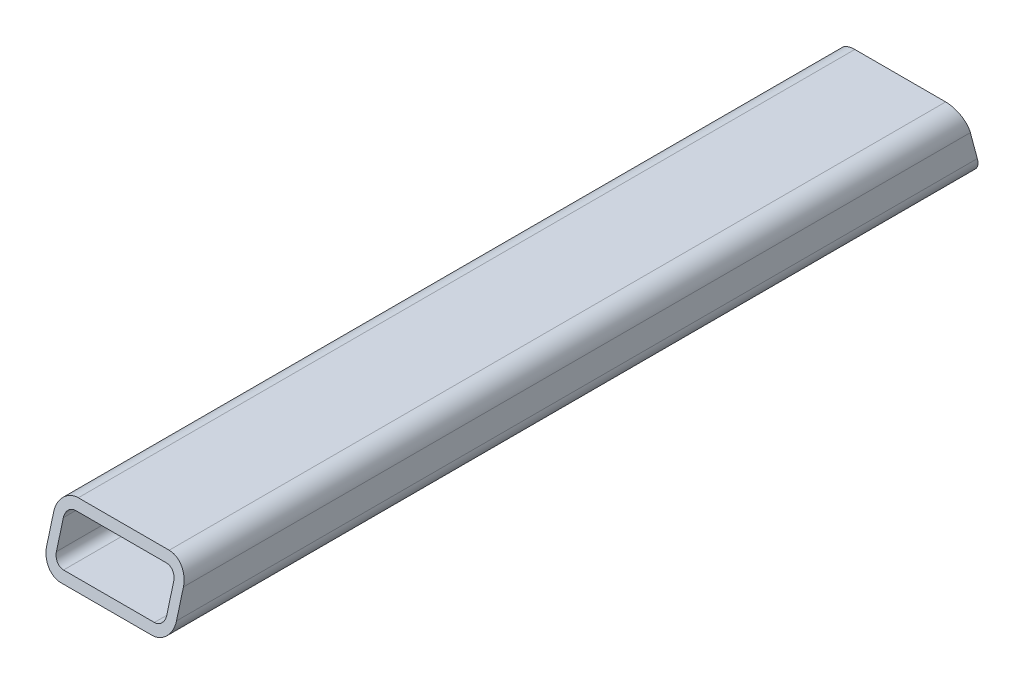
ISO-10303-21;
HEADER;
FILE_DESCRIPTION(('STEP AP214'),'2;1');
FILE_NAME('part.step','',(''),(''),'','','');
FILE_SCHEMA(('AUTOMOTIVE_DESIGN { 1 0 10303 214 1 1 1 1 }'));
ENDSEC;
DATA;
#1=APPLICATION_CONTEXT('core data for automotive mechanical design processes');
#2=APPLICATION_PROTOCOL_DEFINITION('international standard','automotive_design',2000,#1);
#3=PRODUCT_CONTEXT('',#1,'mechanical');
#4=PRODUCT('Part','Part','',(#3));
#5=PRODUCT_RELATED_PRODUCT_CATEGORY('part','',(#4));
#6=PRODUCT_DEFINITION_FORMATION('','',#4);
#7=PRODUCT_DEFINITION_CONTEXT('part definition',#1,'design');
#8=PRODUCT_DEFINITION('design','',#6,#7);
#9=PRODUCT_DEFINITION_SHAPE('','',#8);
#10=(LENGTH_UNIT() NAMED_UNIT(*) SI_UNIT(.MILLI.,.METRE.));
#11=(NAMED_UNIT(*) PLANE_ANGLE_UNIT() SI_UNIT($,.RADIAN.));
#12=(NAMED_UNIT(*) SI_UNIT($,.STERADIAN.) SOLID_ANGLE_UNIT());
#13=UNCERTAINTY_MEASURE_WITH_UNIT(LENGTH_MEASURE(1.E-05),#10,'distance_accuracy_value','');
#14=(GEOMETRIC_REPRESENTATION_CONTEXT(3) GLOBAL_UNCERTAINTY_ASSIGNED_CONTEXT((#13)) GLOBAL_UNIT_ASSIGNED_CONTEXT((#10,
#11,#12)) REPRESENTATION_CONTEXT('',''));
#15=CARTESIAN_POINT('',(0.,0.,0.));
#16=DIRECTION('',(0.,0.,1.));
#17=DIRECTION('',(1.,0.,0.));
#18=AXIS2_PLACEMENT_3D('',#15,#16,#17);
#19=CARTESIAN_POINT('',(14.,-4.,-125.));
#20=DIRECTION('',(0.,0.,1.));
#21=DIRECTION('',(1.,0.,0.));
#22=AXIS2_PLACEMENT_3D('',#19,#20,#21);
#23=CYLINDRICAL_SURFACE('',#22,6.);
#24=DIRECTION('',(0.,0.,1.));
#25=VECTOR('',#24,1.);
#26=CARTESIAN_POINT('',(14.,-10.,-125.));
#27=LINE('',#26,#25);
#28=CARTESIAN_POINT('',(14.,-10.,-125.));
#29=VERTEX_POINT('',#28);
#30=CARTESIAN_POINT('',(14.,-10.,125.));
#31=VERTEX_POINT('',#30);
#32=EDGE_CURVE('E126',#29,#31,#27,.T.);
#33=ORIENTED_EDGE('',*,*,#32,.F.);
#34=CARTESIAN_POINT('',(14.,-4.,-123.392304845413));
#35=DIRECTION('',(0.,0.258819045102518,-0.965925826289069));
#36=DIRECTION('',(0.,0.965925826289069,0.258819045102518));
#37=AXIS2_PLACEMENT_3D('',#34,#35,#36);
#38=ELLIPSE('',#37,6.21165708246049,6.);
#39=CARTESIAN_POINT('',(20.,-3.99999999999996,-123.392304845413));
#40=VERTEX_POINT('',#39);
#41=EDGE_CURVE('E170',#29,#40,#38,.F.);
#42=ORIENTED_EDGE('',*,*,#41,.T.);
#43=DIRECTION('',(0.,0.,1.));
#44=VECTOR('',#43,1.);
#45=CARTESIAN_POINT('',(20.,-3.99999999999996,-125.));
#46=LINE('',#45,#44);
#47=CARTESIAN_POINT('',(20.,-3.99999999999996,123.392304845413));
#48=VERTEX_POINT('',#47);
#49=EDGE_CURVE('E164',#40,#48,#46,.T.);
#50=ORIENTED_EDGE('',*,*,#49,.T.);
#51=CARTESIAN_POINT('',(14.,-4.,123.392304845413));
#52=DIRECTION('',(0.,-0.258819045102518,-0.965925826289069));
#53=DIRECTION('',(0.,-0.965925826289069,0.258819045102518));
#54=AXIS2_PLACEMENT_3D('',#51,#52,#53);
#55=ELLIPSE('',#54,6.21165708246049,6.);
#56=EDGE_CURVE('E173',#48,#31,#55,.T.);
#57=ORIENTED_EDGE('',*,*,#56,.T.);
#58=EDGE_LOOP('',(#33,#42,#50,#57));
#59=FACE_BOUND('',#58,.T.);
#60=ADVANCED_FACE('F43',(#59),#23,.T.);
#61=CARTESIAN_POINT('',(-14.,-10.,-125.));
#62=DIRECTION('',(0.,-1.,0.));
#63=DIRECTION('',(0.,0.,-1.));
#64=AXIS2_PLACEMENT_3D('',#61,#62,#63);
#65=PLANE('',#64);
#66=ORIENTED_EDGE('',*,*,#32,.T.);
#67=DIRECTION('',(1.,0.,0.));
#68=VECTOR('',#67,1.);
#69=CARTESIAN_POINT('',(-14.,-10.,125.));
#70=LINE('',#69,#68);
#71=CARTESIAN_POINT('',(-14.,-10.,125.));
#72=VERTEX_POINT('',#71);
#73=EDGE_CURVE('E179',#72,#31,#70,.T.);
#74=ORIENTED_EDGE('',*,*,#73,.F.);
#75=DIRECTION('',(0.,0.,1.));
#76=VECTOR('',#75,1.);
#77=CARTESIAN_POINT('',(-14.,-10.,-125.));
#78=LINE('',#77,#76);
#79=CARTESIAN_POINT('',(-14.,-10.,-125.));
#80=VERTEX_POINT('',#79);
#81=EDGE_CURVE('E264',#80,#72,#78,.T.);
#82=ORIENTED_EDGE('',*,*,#81,.F.);
#83=DIRECTION('',(1.,0.,0.));
#84=VECTOR('',#83,1.);
#85=CARTESIAN_POINT('',(-14.,-10.,-125.));
#86=LINE('',#85,#84);
#87=EDGE_CURVE('E172',#80,#29,#86,.T.);
#88=ORIENTED_EDGE('',*,*,#87,.T.);
#89=EDGE_LOOP('',(#66,#74,#82,#88));
#90=FACE_BOUND('',#89,.T.);
#91=ADVANCED_FACE('F313',(#90),#65,.T.);
#92=CARTESIAN_POINT('',(-14.,-4.,-125.));
#93=DIRECTION('',(0.,0.,1.));
#94=DIRECTION('',(1.,0.,0.));
#95=AXIS2_PLACEMENT_3D('',#92,#93,#94);
#96=CYLINDRICAL_SURFACE('',#95,6.);
#97=DIRECTION('',(0.,0.,1.));
#98=VECTOR('',#97,1.);
#99=CARTESIAN_POINT('',(-20.,-3.99999999999996,-125.));
#100=LINE('',#99,#98);
#101=CARTESIAN_POINT('',(-20.,-3.99999999999996,-123.392304845413));
#102=VERTEX_POINT('',#101);
#103=CARTESIAN_POINT('',(-20.,-3.99999999999996,123.392304845413));
#104=VERTEX_POINT('',#103);
#105=EDGE_CURVE('E270',#102,#104,#100,.T.);
#106=ORIENTED_EDGE('',*,*,#105,.F.);
#107=CARTESIAN_POINT('',(-14.,-4.,-123.392304845413));
#108=DIRECTION('',(0.,0.258819045102518,-0.965925826289069));
#109=DIRECTION('',(0.,0.965925826289069,0.258819045102518));
#110=AXIS2_PLACEMENT_3D('',#107,#108,#109);
#111=ELLIPSE('',#110,6.2116570824605,6.);
#112=EDGE_CURVE('E177',#102,#80,#111,.F.);
#113=ORIENTED_EDGE('',*,*,#112,.T.);
#114=ORIENTED_EDGE('',*,*,#81,.T.);
#115=CARTESIAN_POINT('',(-14.,-4.,123.392304845413));
#116=DIRECTION('',(0.,-0.258819045102518,-0.965925826289069));
#117=DIRECTION('',(0.,-0.965925826289069,0.258819045102518));
#118=AXIS2_PLACEMENT_3D('',#115,#116,#117);
#119=ELLIPSE('',#118,6.2116570824605,6.);
#120=EDGE_CURVE('E181',#72,#104,#119,.T.);
#121=ORIENTED_EDGE('',*,*,#120,.T.);
#122=EDGE_LOOP('',(#106,#113,#114,#121));
#123=FACE_BOUND('',#122,.T.);
#124=ADVANCED_FACE('F294',(#123),#96,.T.);
#125=CARTESIAN_POINT('',(-20.,3.99999999999996,-125.));
#126=DIRECTION('',(-1.,0.,0.));
#127=DIRECTION('',(0.,0.,1.));
#128=AXIS2_PLACEMENT_3D('',#125,#126,#127);
#129=PLANE('',#128);
#130=DIRECTION('',(0.,0.,1.));
#131=VECTOR('',#130,1.);
#132=CARTESIAN_POINT('',(-20.,3.99999999999996,-125.));
#133=LINE('',#132,#131);
#134=CARTESIAN_POINT('',(-20.,3.99999999999996,-121.248711305964));
#135=VERTEX_POINT('',#134);
#136=CARTESIAN_POINT('',(-20.,3.99999999999996,121.248711305964));
#137=VERTEX_POINT('',#136);
#138=EDGE_CURVE('E269',#135,#137,#133,.T.);
#139=ORIENTED_EDGE('',*,*,#138,.F.);
#140=DIRECTION('',(0.,-0.965925826289069,-0.258819045102518));
#141=VECTOR('',#140,1.);
#142=CARTESIAN_POINT('',(-20.,3.06217782649103,-121.5));
#143=LINE('',#142,#141);
#144=EDGE_CURVE('E286',#135,#102,#143,.T.);
#145=ORIENTED_EDGE('',*,*,#144,.T.);
#146=ORIENTED_EDGE('',*,*,#105,.T.);
#147=DIRECTION('',(0.,-0.965925826289069,0.258819045102518));
#148=VECTOR('',#147,1.);
#149=CARTESIAN_POINT('',(-20.,65.5621778264905,104.753175473055));
#150=LINE('',#149,#148);
#151=EDGE_CURVE('E290',#104,#137,#150,.F.);
#152=ORIENTED_EDGE('',*,*,#151,.T.);
#153=EDGE_LOOP('',(#139,#145,#146,#152));
#154=FACE_BOUND('',#153,.T.);
#155=ADVANCED_FACE('F297',(#154),#129,.T.);
#156=CARTESIAN_POINT('',(-14.,4.,-125.));
#157=DIRECTION('',(0.,0.,1.));
#158=DIRECTION('',(1.,0.,0.));
#159=AXIS2_PLACEMENT_3D('',#156,#157,#158);
#160=CYLINDRICAL_SURFACE('',#159,6.);
#161=DIRECTION('',(0.,0.,1.));
#162=VECTOR('',#161,1.);
#163=CARTESIAN_POINT('',(-14.,10.,-125.));
#164=LINE('',#163,#162);
#165=CARTESIAN_POINT('',(-14.,10.,-119.641016151378));
#166=VERTEX_POINT('',#165);
#167=CARTESIAN_POINT('',(-14.,10.,119.641016151378));
#168=VERTEX_POINT('',#167);
#169=EDGE_CURVE('E273',#166,#168,#164,.T.);
#170=ORIENTED_EDGE('',*,*,#169,.F.);
#171=CARTESIAN_POINT('',(-14.,4.,-121.248711305964));
#172=DIRECTION('',(0.,0.258819045102518,-0.965925826289069));
#173=DIRECTION('',(0.,0.965925826289069,0.258819045102518));
#174=AXIS2_PLACEMENT_3D('',#171,#172,#173);
#175=ELLIPSE('',#174,6.21165708246049,6.);
#176=EDGE_CURVE('E283',#166,#135,#175,.F.);
#177=ORIENTED_EDGE('',*,*,#176,.T.);
#178=ORIENTED_EDGE('',*,*,#138,.T.);
#179=CARTESIAN_POINT('',(-14.,4.,121.248711305964));
#180=DIRECTION('',(0.,-0.258819045102518,-0.965925826289069));
#181=DIRECTION('',(0.,-0.965925826289069,0.258819045102518));
#182=AXIS2_PLACEMENT_3D('',#179,#180,#181);
#183=ELLIPSE('',#182,6.21165708246049,6.);
#184=EDGE_CURVE('E284',#137,#168,#183,.T.);
#185=ORIENTED_EDGE('',*,*,#184,.T.);
#186=EDGE_LOOP('',(#170,#177,#178,#185));
#187=FACE_BOUND('',#186,.T.);
#188=ADVANCED_FACE('F304',(#187),#160,.T.);
#189=CARTESIAN_POINT('',(-14.,10.,-125.));
#190=DIRECTION('',(0.,1.,0.));
#191=DIRECTION('',(0.,0.,1.));
#192=AXIS2_PLACEMENT_3D('',#189,#190,#191);
#193=PLANE('',#192);
#194=DIRECTION('',(0.,0.,1.));
#195=VECTOR('',#194,1.);
#196=CARTESIAN_POINT('',(14.,10.,-125.));
#197=LINE('',#196,#195);
#198=CARTESIAN_POINT('',(14.,10.,-119.641016151378));
#199=VERTEX_POINT('',#198);
#200=CARTESIAN_POINT('',(14.,10.,119.641016151378));
#201=VERTEX_POINT('',#200);
#202=EDGE_CURVE('E276',#199,#201,#197,.T.);
#203=ORIENTED_EDGE('',*,*,#202,.F.);
#204=DIRECTION('',(-1.,0.,0.));
#205=VECTOR('',#204,1.);
#206=CARTESIAN_POINT('',(-14.,10.,-119.641016151378));
#207=LINE('',#206,#205);
#208=EDGE_CURVE('E279',#199,#166,#207,.T.);
#209=ORIENTED_EDGE('',*,*,#208,.T.);
#210=ORIENTED_EDGE('',*,*,#169,.T.);
#211=DIRECTION('',(1.,0.,0.));
#212=VECTOR('',#211,1.);
#213=CARTESIAN_POINT('',(-14.,10.,119.641016151378));
#214=LINE('',#213,#212);
#215=EDGE_CURVE('E261',#168,#201,#214,.T.);
#216=ORIENTED_EDGE('',*,*,#215,.T.);
#217=EDGE_LOOP('',(#203,#209,#210,#216));
#218=FACE_BOUND('',#217,.T.);
#219=ADVANCED_FACE('F310',(#218),#193,.T.);
#220=CARTESIAN_POINT('',(14.,4.,-125.));
#221=DIRECTION('',(0.,0.,1.));
#222=DIRECTION('',(1.,0.,0.));
#223=AXIS2_PLACEMENT_3D('',#220,#221,#222);
#224=CYLINDRICAL_SURFACE('',#223,6.);
#225=DIRECTION('',(0.,0.,1.));
#226=VECTOR('',#225,1.);
#227=CARTESIAN_POINT('',(20.,3.99999999999996,-125.));
#228=LINE('',#227,#226);
#229=CARTESIAN_POINT('',(20.,3.99999999999996,-121.248711305964));
#230=VERTEX_POINT('',#229);
#231=CARTESIAN_POINT('',(20.,3.99999999999996,121.248711305964));
#232=VERTEX_POINT('',#231);
#233=EDGE_CURVE('E163',#230,#232,#228,.T.);
#234=ORIENTED_EDGE('',*,*,#233,.F.);
#235=CARTESIAN_POINT('',(14.,4.,-121.248711305964));
#236=DIRECTION('',(0.,0.258819045102518,-0.965925826289069));
#237=DIRECTION('',(0.,0.965925826289069,0.258819045102518));
#238=AXIS2_PLACEMENT_3D('',#235,#236,#237);
#239=ELLIPSE('',#238,6.2116570824605,6.);
#240=EDGE_CURVE('E11',#230,#199,#239,.F.);
#241=ORIENTED_EDGE('',*,*,#240,.T.);
#242=ORIENTED_EDGE('',*,*,#202,.T.);
#243=CARTESIAN_POINT('',(14.,4.,121.248711305964));
#244=DIRECTION('',(0.,-0.258819045102518,-0.965925826289069));
#245=DIRECTION('',(0.,-0.965925826289069,0.258819045102518));
#246=AXIS2_PLACEMENT_3D('',#243,#244,#245);
#247=ELLIPSE('',#246,6.2116570824605,6.);
#248=EDGE_CURVE('E53',#201,#232,#247,.T.);
#249=ORIENTED_EDGE('',*,*,#248,.T.);
#250=EDGE_LOOP('',(#234,#241,#242,#249));
#251=FACE_BOUND('',#250,.T.);
#252=ADVANCED_FACE('F319',(#251),#224,.T.);
#253=CARTESIAN_POINT('',(20.,3.99999999999996,-125.));
#254=DIRECTION('',(1.,0.,0.));
#255=DIRECTION('',(0.,0.,-1.));
#256=AXIS2_PLACEMENT_3D('',#253,#254,#255);
#257=PLANE('',#256);
#258=ORIENTED_EDGE('',*,*,#49,.F.);
#259=DIRECTION('',(0.,0.965925826289069,0.258819045102518));
#260=VECTOR('',#259,1.);
#261=CARTESIAN_POINT('',(20.,3.06217782649103,-121.5));
#262=LINE('',#261,#260);
#263=EDGE_CURVE('E167',#40,#230,#262,.T.);
#264=ORIENTED_EDGE('',*,*,#263,.T.);
#265=ORIENTED_EDGE('',*,*,#233,.T.);
#266=DIRECTION('',(0.,0.965925826289069,-0.258819045102518));
#267=VECTOR('',#266,1.);
#268=CARTESIAN_POINT('',(20.,65.5621778264905,104.753175473055));
#269=LINE('',#268,#267);
#270=EDGE_CURVE('E158',#232,#48,#269,.F.);
#271=ORIENTED_EDGE('',*,*,#270,.T.);
#272=EDGE_LOOP('',(#258,#264,#265,#271));
#273=FACE_BOUND('',#272,.T.);
#274=ADVANCED_FACE('F165',(#273),#257,.T.);
#275=CARTESIAN_POINT('',(14.,-4.,-125.));
#276=DIRECTION('',(0.,0.,1.));
#277=DIRECTION('',(1.,0.,0.));
#278=AXIS2_PLACEMENT_3D('',#275,#276,#277);
#279=CYLINDRICAL_SURFACE('',#278,3.);
#280=DIRECTION('',(0.,0.,1.));
#281=VECTOR('',#280,1.);
#282=CARTESIAN_POINT('',(17.,-3.99999999999998,-125.));
#283=LINE('',#282,#281);
#284=CARTESIAN_POINT('',(17.,-3.99999999999998,-123.392304845413));
#285=VERTEX_POINT('',#284);
#286=CARTESIAN_POINT('',(17.,-3.99999999999998,123.392304845413));
#287=VERTEX_POINT('',#286);
#288=EDGE_CURVE('E195',#285,#287,#283,.T.);
#289=ORIENTED_EDGE('',*,*,#288,.F.);
#290=CARTESIAN_POINT('',(14.,-4.,-123.392304845413));
#291=DIRECTION('',(0.,0.258819045102518,-0.965925826289069));
#292=DIRECTION('',(0.,0.965925826289069,0.258819045102518));
#293=AXIS2_PLACEMENT_3D('',#290,#291,#292);
#294=ELLIPSE('',#293,3.10582854123025,3.);
#295=CARTESIAN_POINT('',(14.,-7.,-124.196152422707));
#296=VERTEX_POINT('',#295);
#297=EDGE_CURVE('E212',#296,#285,#294,.F.);
#298=ORIENTED_EDGE('',*,*,#297,.F.);
#299=DIRECTION('',(0.,0.,-1.));
#300=VECTOR('',#299,1.);
#301=CARTESIAN_POINT('',(14.,-7.,-125.));
#302=LINE('',#301,#300);
#303=CARTESIAN_POINT('',(14.,-7.,124.196152422707));
#304=VERTEX_POINT('',#303);
#305=EDGE_CURVE('E239',#296,#304,#302,.F.);
#306=ORIENTED_EDGE('',*,*,#305,.T.);
#307=CARTESIAN_POINT('',(14.,-4.,123.392304845413));
#308=DIRECTION('',(0.,-0.258819045102518,-0.965925826289069));
#309=DIRECTION('',(0.,-0.965925826289069,0.258819045102518));
#310=AXIS2_PLACEMENT_3D('',#307,#308,#309);
#311=ELLIPSE('',#310,3.10582854123025,3.);
#312=EDGE_CURVE('E211',#304,#287,#311,.F.);
#313=ORIENTED_EDGE('',*,*,#312,.T.);
#314=EDGE_LOOP('',(#289,#298,#306,#313));
#315=FACE_BOUND('',#314,.T.);
#316=ADVANCED_FACE('F245',(#315),#279,.F.);
#317=CARTESIAN_POINT('',(-14.,-7.,-125.));
#318=DIRECTION('',(0.,-1.,0.));
#319=DIRECTION('',(0.,0.,-1.));
#320=AXIS2_PLACEMENT_3D('',#317,#318,#319);
#321=PLANE('',#320);
#322=ORIENTED_EDGE('',*,*,#305,.F.);
#323=DIRECTION('',(1.,0.,0.));
#324=VECTOR('',#323,1.);
#325=CARTESIAN_POINT('',(-14.,-7.,-124.196152422707));
#326=LINE('',#325,#324);
#327=CARTESIAN_POINT('',(-14.,-7.,-124.196152422707));
#328=VERTEX_POINT('',#327);
#329=EDGE_CURVE('E189',#328,#296,#326,.T.);
#330=ORIENTED_EDGE('',*,*,#329,.F.);
#331=DIRECTION('',(0.,0.,1.));
#332=VECTOR('',#331,1.);
#333=CARTESIAN_POINT('',(-14.,-7.,-125.));
#334=LINE('',#333,#332);
#335=CARTESIAN_POINT('',(-14.,-7.,124.196152422707));
#336=VERTEX_POINT('',#335);
#337=EDGE_CURVE('E238',#328,#336,#334,.T.);
#338=ORIENTED_EDGE('',*,*,#337,.T.);
#339=DIRECTION('',(-1.,0.,0.));
#340=VECTOR('',#339,1.);
#341=CARTESIAN_POINT('',(14.,-7.,124.196152422707));
#342=LINE('',#341,#340);
#343=EDGE_CURVE('E48',#336,#304,#342,.F.);
#344=ORIENTED_EDGE('',*,*,#343,.T.);
#345=EDGE_LOOP('',(#322,#330,#338,#344));
#346=FACE_BOUND('',#345,.T.);
#347=ADVANCED_FACE('F233',(#346),#321,.F.);
#348=CARTESIAN_POINT('',(-14.,-4.,-125.));
#349=DIRECTION('',(0.,0.,1.));
#350=DIRECTION('',(1.,0.,0.));
#351=AXIS2_PLACEMENT_3D('',#348,#349,#350);
#352=CYLINDRICAL_SURFACE('',#351,3.);
#353=ORIENTED_EDGE('',*,*,#337,.F.);
#354=CARTESIAN_POINT('',(-14.,-4.,-123.392304845413));
#355=DIRECTION('',(0.,0.258819045102518,-0.965925826289069));
#356=DIRECTION('',(0.,0.965925826289069,0.258819045102518));
#357=AXIS2_PLACEMENT_3D('',#354,#355,#356);
#358=ELLIPSE('',#357,3.10582854123025,3.);
#359=CARTESIAN_POINT('',(-17.,-3.99999999999996,-123.392304845413));
#360=VERTEX_POINT('',#359);
#361=EDGE_CURVE('E193',#360,#328,#358,.F.);
#362=ORIENTED_EDGE('',*,*,#361,.F.);
#363=DIRECTION('',(0.,0.,1.));
#364=VECTOR('',#363,1.);
#365=CARTESIAN_POINT('',(-17.,-3.99999999999996,-125.));
#366=LINE('',#365,#364);
#367=CARTESIAN_POINT('',(-17.,-3.99999999999996,123.392304845413));
#368=VERTEX_POINT('',#367);
#369=EDGE_CURVE('E247',#360,#368,#366,.T.);
#370=ORIENTED_EDGE('',*,*,#369,.T.);
#371=CARTESIAN_POINT('',(-14.,-4.,123.392304845413));
#372=DIRECTION('',(0.,-0.258819045102518,-0.965925826289069));
#373=DIRECTION('',(0.,-0.965925826289069,0.258819045102518));
#374=AXIS2_PLACEMENT_3D('',#371,#372,#373);
#375=ELLIPSE('',#374,3.10582854123025,3.);
#376=EDGE_CURVE('E120',#368,#336,#375,.F.);
#377=ORIENTED_EDGE('',*,*,#376,.T.);
#378=EDGE_LOOP('',(#353,#362,#370,#377));
#379=FACE_BOUND('',#378,.T.);
#380=ADVANCED_FACE('F391',(#379),#352,.F.);
#381=CARTESIAN_POINT('',(-17.,3.99999999999996,-125.));
#382=DIRECTION('',(-1.,0.,0.));
#383=DIRECTION('',(0.,0.,1.));
#384=AXIS2_PLACEMENT_3D('',#381,#382,#383);
#385=PLANE('',#384);
#386=ORIENTED_EDGE('',*,*,#369,.F.);
#387=DIRECTION('',(0.,-0.965925826289069,-0.258819045102518));
#388=VECTOR('',#387,1.);
#389=CARTESIAN_POINT('',(-17.,3.06217782649103,-121.5));
#390=LINE('',#389,#388);
#391=CARTESIAN_POINT('',(-17.,3.99999999999998,-121.248711305964));
#392=VERTEX_POINT('',#391);
#393=EDGE_CURVE('E196',#392,#360,#390,.T.);
#394=ORIENTED_EDGE('',*,*,#393,.F.);
#395=DIRECTION('',(0.,0.,1.));
#396=VECTOR('',#395,1.);
#397=CARTESIAN_POINT('',(-17.,3.99999999999998,-125.));
#398=LINE('',#397,#396);
#399=CARTESIAN_POINT('',(-17.,3.99999999999998,121.248711305964));
#400=VERTEX_POINT('',#399);
#401=EDGE_CURVE('E251',#392,#400,#398,.T.);
#402=ORIENTED_EDGE('',*,*,#401,.T.);
#403=DIRECTION('',(0.,0.965925826289069,-0.258819045102518));
#404=VECTOR('',#403,1.);
#405=CARTESIAN_POINT('',(-17.,-10.0000000000002,125.));
#406=LINE('',#405,#404);
#407=EDGE_CURVE('E229',#400,#368,#406,.F.);
#408=ORIENTED_EDGE('',*,*,#407,.T.);
#409=EDGE_LOOP('',(#386,#394,#402,#408));
#410=FACE_BOUND('',#409,.T.);
#411=ADVANCED_FACE('F404',(#410),#385,.F.);
#412=CARTESIAN_POINT('',(-14.,4.,-125.));
#413=DIRECTION('',(0.,0.,1.));
#414=DIRECTION('',(1.,0.,0.));
#415=AXIS2_PLACEMENT_3D('',#412,#413,#414);
#416=CYLINDRICAL_SURFACE('',#415,3.);
#417=ORIENTED_EDGE('',*,*,#401,.F.);
#418=CARTESIAN_POINT('',(-14.,4.,-121.248711305964));
#419=DIRECTION('',(0.,0.258819045102518,-0.965925826289069));
#420=DIRECTION('',(0.,0.965925826289069,0.258819045102518));
#421=AXIS2_PLACEMENT_3D('',#418,#419,#420);
#422=ELLIPSE('',#421,3.10582854123025,3.);
#423=CARTESIAN_POINT('',(-14.,7.,-120.444863728671));
#424=VERTEX_POINT('',#423);
#425=EDGE_CURVE('E197',#424,#392,#422,.F.);
#426=ORIENTED_EDGE('',*,*,#425,.F.);
#427=DIRECTION('',(0.,0.,1.));
#428=VECTOR('',#427,1.);
#429=CARTESIAN_POINT('',(-14.,7.,-125.));
#430=LINE('',#429,#428);
#431=CARTESIAN_POINT('',(-14.,7.,120.444863728671));
#432=VERTEX_POINT('',#431);
#433=EDGE_CURVE('E252',#424,#432,#430,.T.);
#434=ORIENTED_EDGE('',*,*,#433,.T.);
#435=CARTESIAN_POINT('',(-14.,4.,121.248711305964));
#436=DIRECTION('',(0.,-0.258819045102518,-0.965925826289069));
#437=DIRECTION('',(0.,-0.965925826289069,0.258819045102518));
#438=AXIS2_PLACEMENT_3D('',#435,#436,#437);
#439=ELLIPSE('',#438,3.10582854123025,3.);
#440=EDGE_CURVE('E228',#432,#400,#439,.F.);
#441=ORIENTED_EDGE('',*,*,#440,.T.);
#442=EDGE_LOOP('',(#417,#426,#434,#441));
#443=FACE_BOUND('',#442,.T.);
#444=ADVANCED_FACE('F411',(#443),#416,.F.);
#445=CARTESIAN_POINT('',(-14.,7.,-125.));
#446=DIRECTION('',(0.,1.,0.));
#447=DIRECTION('',(0.,0.,1.));
#448=AXIS2_PLACEMENT_3D('',#445,#446,#447);
#449=PLANE('',#448);
#450=ORIENTED_EDGE('',*,*,#433,.F.);
#451=DIRECTION('',(-1.,0.,0.));
#452=VECTOR('',#451,1.);
#453=CARTESIAN_POINT('',(-14.,7.,-120.444863728671));
#454=LINE('',#453,#452);
#455=CARTESIAN_POINT('',(14.,7.,-120.444863728671));
#456=VERTEX_POINT('',#455);
#457=EDGE_CURVE('E205',#456,#424,#454,.T.);
#458=ORIENTED_EDGE('',*,*,#457,.F.);
#459=DIRECTION('',(0.,0.,1.));
#460=VECTOR('',#459,1.);
#461=CARTESIAN_POINT('',(14.,7.,-125.));
#462=LINE('',#461,#460);
#463=CARTESIAN_POINT('',(14.,7.,120.444863728671));
#464=VERTEX_POINT('',#463);
#465=EDGE_CURVE('E257',#456,#464,#462,.T.);
#466=ORIENTED_EDGE('',*,*,#465,.T.);
#467=DIRECTION('',(1.,0.,0.));
#468=VECTOR('',#467,1.);
#469=CARTESIAN_POINT('',(14.,7.,120.444863728671));
#470=LINE('',#469,#468);
#471=EDGE_CURVE('E222',#464,#432,#470,.F.);
#472=ORIENTED_EDGE('',*,*,#471,.T.);
#473=EDGE_LOOP('',(#450,#458,#466,#472));
#474=FACE_BOUND('',#473,.T.);
#475=ADVANCED_FACE('F350',(#474),#449,.F.);
#476=CARTESIAN_POINT('',(14.,4.,-125.));
#477=DIRECTION('',(0.,0.,1.));
#478=DIRECTION('',(1.,0.,0.));
#479=AXIS2_PLACEMENT_3D('',#476,#477,#478);
#480=CYLINDRICAL_SURFACE('',#479,3.);
#481=ORIENTED_EDGE('',*,*,#465,.F.);
#482=CARTESIAN_POINT('',(14.,4.,-121.248711305964));
#483=DIRECTION('',(0.,0.258819045102518,-0.965925826289069));
#484=DIRECTION('',(0.,0.965925826289069,0.258819045102518));
#485=AXIS2_PLACEMENT_3D('',#482,#483,#484);
#486=ELLIPSE('',#485,3.10582854123025,3.);
#487=CARTESIAN_POINT('',(17.,3.99999999999996,-121.248711305964));
#488=VERTEX_POINT('',#487);
#489=EDGE_CURVE('E204',#488,#456,#486,.F.);
#490=ORIENTED_EDGE('',*,*,#489,.F.);
#491=DIRECTION('',(0.,0.,-1.));
#492=VECTOR('',#491,1.);
#493=CARTESIAN_POINT('',(17.,3.99999999999996,-125.));
#494=LINE('',#493,#492);
#495=CARTESIAN_POINT('',(17.,3.99999999999996,121.248711305964));
#496=VERTEX_POINT('',#495);
#497=EDGE_CURVE('E260',#488,#496,#494,.F.);
#498=ORIENTED_EDGE('',*,*,#497,.T.);
#499=CARTESIAN_POINT('',(14.,4.,121.248711305964));
#500=DIRECTION('',(0.,-0.258819045102518,-0.965925826289069));
#501=DIRECTION('',(0.,-0.965925826289069,0.258819045102518));
#502=AXIS2_PLACEMENT_3D('',#499,#500,#501);
#503=ELLIPSE('',#502,3.10582854123025,3.);
#504=EDGE_CURVE('E216',#496,#464,#503,.F.);
#505=ORIENTED_EDGE('',*,*,#504,.T.);
#506=EDGE_LOOP('',(#481,#490,#498,#505));
#507=FACE_BOUND('',#506,.T.);
#508=ADVANCED_FACE('F341',(#507),#480,.F.);
#509=CARTESIAN_POINT('',(17.,3.99999999999996,-125.));
#510=DIRECTION('',(1.,0.,0.));
#511=DIRECTION('',(0.,0.,-1.));
#512=AXIS2_PLACEMENT_3D('',#509,#510,#511);
#513=PLANE('',#512);
#514=ORIENTED_EDGE('',*,*,#497,.F.);
#515=DIRECTION('',(0.,0.965925826289069,0.258819045102518));
#516=VECTOR('',#515,1.);
#517=CARTESIAN_POINT('',(17.,3.06217782649103,-121.5));
#518=LINE('',#517,#516);
#519=EDGE_CURVE('E209',#285,#488,#518,.T.);
#520=ORIENTED_EDGE('',*,*,#519,.F.);
#521=ORIENTED_EDGE('',*,*,#288,.T.);
#522=DIRECTION('',(0.,-0.965925826289069,0.258819045102518));
#523=VECTOR('',#522,1.);
#524=CARTESIAN_POINT('',(17.,-10.0000000000002,125.));
#525=LINE('',#524,#523);
#526=EDGE_CURVE('E219',#287,#496,#525,.F.);
#527=ORIENTED_EDGE('',*,*,#526,.T.);
#528=EDGE_LOOP('',(#514,#520,#521,#527));
#529=FACE_BOUND('',#528,.T.);
#530=ADVANCED_FACE('F338',(#529),#513,.F.);
#531=CARTESIAN_POINT('',(-14.,10.,-119.641016151378));
#532=DIRECTION('',(0.,0.258819045102518,-0.965925826289069));
#533=DIRECTION('',(1.,0.,0.));
#534=AXIS2_PLACEMENT_3D('',#531,#532,#533);
#535=PLANE('',#534);
#536=ORIENTED_EDGE('',*,*,#41,.F.);
#537=ORIENTED_EDGE('',*,*,#87,.F.);
#538=ORIENTED_EDGE('',*,*,#112,.F.);
#539=ORIENTED_EDGE('',*,*,#144,.F.);
#540=ORIENTED_EDGE('',*,*,#176,.F.);
#541=ORIENTED_EDGE('',*,*,#208,.F.);
#542=ORIENTED_EDGE('',*,*,#240,.F.);
#543=ORIENTED_EDGE('',*,*,#263,.F.);
#544=EDGE_LOOP('',(#536,#537,#538,#539,#540,#541,#542,#543));
#545=FACE_BOUND('',#544,.T.);
#546=ORIENTED_EDGE('',*,*,#329,.T.);
#547=ORIENTED_EDGE('',*,*,#297,.T.);
#548=ORIENTED_EDGE('',*,*,#519,.T.);
#549=ORIENTED_EDGE('',*,*,#489,.T.);
#550=ORIENTED_EDGE('',*,*,#457,.T.);
#551=ORIENTED_EDGE('',*,*,#425,.T.);
#552=ORIENTED_EDGE('',*,*,#393,.T.);
#553=ORIENTED_EDGE('',*,*,#361,.T.);
#554=EDGE_LOOP('',(#546,#547,#548,#549,#550,#551,#552,#553));
#555=FACE_BOUND('',#554,.T.);
#556=ADVANCED_FACE('F312',(#545,#555),#535,.T.);
#557=CARTESIAN_POINT('',(14.,-10.0000000000002,125.));
#558=DIRECTION('',(0.,-0.258819045102518,-0.965925826289069));
#559=DIRECTION('',(-1.,0.,0.));
#560=AXIS2_PLACEMENT_3D('',#557,#558,#559);
#561=PLANE('',#560);
#562=ORIENTED_EDGE('',*,*,#248,.F.);
#563=ORIENTED_EDGE('',*,*,#215,.F.);
#564=ORIENTED_EDGE('',*,*,#184,.F.);
#565=ORIENTED_EDGE('',*,*,#151,.F.);
#566=ORIENTED_EDGE('',*,*,#120,.F.);
#567=ORIENTED_EDGE('',*,*,#73,.T.);
#568=ORIENTED_EDGE('',*,*,#56,.F.);
#569=ORIENTED_EDGE('',*,*,#270,.F.);
#570=EDGE_LOOP('',(#562,#563,#564,#565,#566,#567,#568,#569));
#571=FACE_BOUND('',#570,.T.);
#572=ORIENTED_EDGE('',*,*,#312,.F.);
#573=ORIENTED_EDGE('',*,*,#343,.F.);
#574=ORIENTED_EDGE('',*,*,#376,.F.);
#575=ORIENTED_EDGE('',*,*,#407,.F.);
#576=ORIENTED_EDGE('',*,*,#440,.F.);
#577=ORIENTED_EDGE('',*,*,#471,.F.);
#578=ORIENTED_EDGE('',*,*,#504,.F.);
#579=ORIENTED_EDGE('',*,*,#526,.F.);
#580=EDGE_LOOP('',(#572,#573,#574,#575,#576,#577,#578,#579));
#581=FACE_BOUND('',#580,.T.);
#582=ADVANCED_FACE('F46',(#571,#581),#561,.F.);
#583=CLOSED_SHELL('',(#60,#91,#124,#155,#188,#219,#252,#274,#316,#347,#380,#411,#444,#475,#508,
#530,#556,#582));
#584=MANIFOLD_SOLID_BREP('B2',#583);
#585=ADVANCED_BREP_SHAPE_REPRESENTATION('',(#18,#584),#14);
#586=SHAPE_DEFINITION_REPRESENTATION(#9,#585);
ENDSEC;
END-ISO-10303-21;
